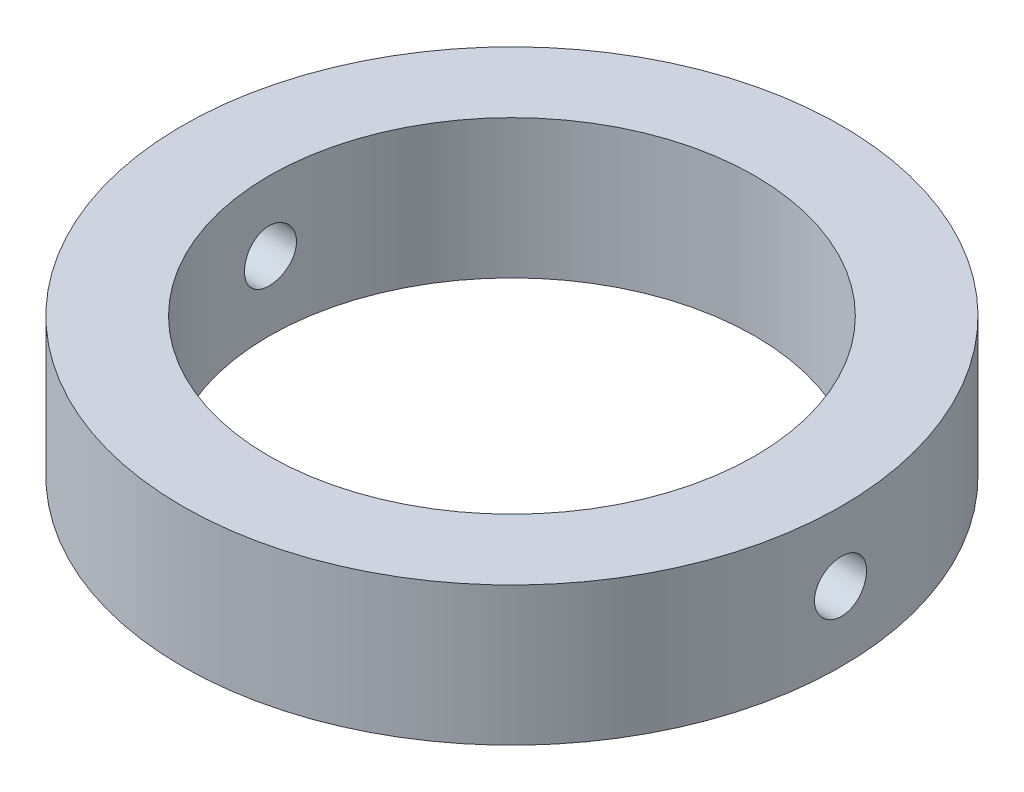
ISO-10303-21;
HEADER;
FILE_DESCRIPTION(('STEP AP214'),'2;1');
FILE_NAME('part.step','',(''),(''),'','','');
FILE_SCHEMA(('AUTOMOTIVE_DESIGN { 1 0 10303 214 1 1 1 1 }'));
ENDSEC;
DATA;
#1=APPLICATION_CONTEXT('core data for automotive mechanical design processes');
#2=APPLICATION_PROTOCOL_DEFINITION('international standard','automotive_design',2000,#1);
#3=PRODUCT_CONTEXT('',#1,'mechanical');
#4=PRODUCT('Part','Part','',(#3));
#5=PRODUCT_RELATED_PRODUCT_CATEGORY('part','',(#4));
#6=PRODUCT_DEFINITION_FORMATION('','',#4);
#7=PRODUCT_DEFINITION_CONTEXT('part definition',#1,'design');
#8=PRODUCT_DEFINITION('design','',#6,#7);
#9=PRODUCT_DEFINITION_SHAPE('','',#8);
#10=(LENGTH_UNIT() NAMED_UNIT(*) SI_UNIT(.MILLI.,.METRE.));
#11=(NAMED_UNIT(*) PLANE_ANGLE_UNIT() SI_UNIT($,.RADIAN.));
#12=(NAMED_UNIT(*) SI_UNIT($,.STERADIAN.) SOLID_ANGLE_UNIT());
#13=UNCERTAINTY_MEASURE_WITH_UNIT(LENGTH_MEASURE(1.E-05),#10,'distance_accuracy_value','');
#14=(GEOMETRIC_REPRESENTATION_CONTEXT(3) GLOBAL_UNCERTAINTY_ASSIGNED_CONTEXT((#13)) GLOBAL_UNIT_ASSIGNED_CONTEXT((#10,
#11,#12)) REPRESENTATION_CONTEXT('',''));
#15=CARTESIAN_POINT('',(0.,0.,0.));
#16=DIRECTION('',(0.,0.,1.));
#17=DIRECTION('',(1.,0.,0.));
#18=AXIS2_PLACEMENT_3D('',#15,#16,#17);
#19=CARTESIAN_POINT('',(0.,16.,0.));
#20=DIRECTION('',(0.,1.,0.));
#21=DIRECTION('',(0.,0.,1.));
#22=AXIS2_PLACEMENT_3D('',#19,#20,#21);
#23=PLANE('',#22);
#24=CARTESIAN_POINT('',(0.,16.,0.));
#25=DIRECTION('',(0.,1.,0.));
#26=DIRECTION('',(0.,0.,1.));
#27=AXIS2_PLACEMENT_3D('',#24,#25,#26);
#28=CIRCLE('',#27,38.);
#29=CARTESIAN_POINT('',(0.,16.,38.));
#30=VERTEX_POINT('',#29);
#31=EDGE_CURVE('E10',#30,#30,#28,.T.);
#32=ORIENTED_EDGE('',*,*,#31,.T.);
#33=EDGE_LOOP('',(#32));
#34=FACE_BOUND('',#33,.T.);
#35=CARTESIAN_POINT('',(0.,16.,0.));
#36=DIRECTION('',(0.,1.,0.));
#37=DIRECTION('',(0.,0.,1.));
#38=AXIS2_PLACEMENT_3D('',#35,#36,#37);
#39=CIRCLE('',#38,28.);
#40=CARTESIAN_POINT('',(0.,16.,28.));
#41=VERTEX_POINT('',#40);
#42=EDGE_CURVE('E46',#41,#41,#39,.T.);
#43=ORIENTED_EDGE('',*,*,#42,.F.);
#44=EDGE_LOOP('',(#43));
#45=FACE_BOUND('',#44,.T.);
#46=ADVANCED_FACE('F28',(#34,#45),#23,.T.);
#47=CARTESIAN_POINT('',(0.,0.,0.));
#48=DIRECTION('',(0.,1.,0.));
#49=DIRECTION('',(0.,0.,1.));
#50=AXIS2_PLACEMENT_3D('',#47,#48,#49);
#51=PLANE('',#50);
#52=CARTESIAN_POINT('',(0.,0.,0.));
#53=DIRECTION('',(0.,1.,0.));
#54=DIRECTION('',(0.,0.,1.));
#55=AXIS2_PLACEMENT_3D('',#52,#53,#54);
#56=CIRCLE('',#55,38.);
#57=CARTESIAN_POINT('',(0.,0.,38.));
#58=VERTEX_POINT('',#57);
#59=EDGE_CURVE('E41',#58,#58,#56,.T.);
#60=ORIENTED_EDGE('',*,*,#59,.F.);
#61=EDGE_LOOP('',(#60));
#62=FACE_BOUND('',#61,.T.);
#63=CARTESIAN_POINT('',(0.,0.,0.));
#64=DIRECTION('',(0.,1.,0.));
#65=DIRECTION('',(0.,0.,1.));
#66=AXIS2_PLACEMENT_3D('',#63,#64,#65);
#67=CIRCLE('',#66,28.);
#68=CARTESIAN_POINT('',(0.,0.,28.));
#69=VERTEX_POINT('',#68);
#70=EDGE_CURVE('E49',#69,#69,#67,.T.);
#71=ORIENTED_EDGE('',*,*,#70,.T.);
#72=EDGE_LOOP('',(#71));
#73=FACE_BOUND('',#72,.T.);
#74=ADVANCED_FACE('F82',(#62,#73),#51,.F.);
#75=CARTESIAN_POINT('',(0.,16.,0.));
#76=DIRECTION('',(0.,-1.,0.));
#77=DIRECTION('',(0.,0.,-1.));
#78=AXIS2_PLACEMENT_3D('',#75,#76,#77);
#79=CYLINDRICAL_SURFACE('',#78,38.);
#80=CARTESIAN_POINT('',(37.8813938496433,8.00000000000001,3.00000000136798));
#81=CARTESIAN_POINT('',(37.8813954247277,8.16822935622384,2.99999263922029));
#82=CARTESIAN_POINT('',(37.8825265581789,8.33657400624572,2.98580184986723));
#83=CARTESIAN_POINT('',(37.8869289646633,8.66860764995834,2.92939975069717));
#84=CARTESIAN_POINT('',(37.8902026780725,8.83229111250012,2.88715648860533));
#85=CARTESIAN_POINT('',(37.8985171540645,9.15014522375829,2.77587681745086));
#86=CARTESIAN_POINT('',(37.9035569308881,9.30432112294914,2.70685535281322));
#87=CARTESIAN_POINT('',(37.9148344390326,9.59886160169097,2.54400458582102));
#88=CARTESIAN_POINT('',(37.9210719099115,9.73922917388586,2.45018067516325));
#89=CARTESIAN_POINT('',(37.9340582511964,10.0025313722688,2.24015280482132));
#90=CARTESIAN_POINT('',(37.9408081454684,10.1254296076377,2.12390328291686));
#91=CARTESIAN_POINT('',(37.9540493837052,10.3499920901396,1.87242010853816));
#92=CARTESIAN_POINT('',(37.9605407164859,10.4516554195469,1.73718563599854));
#93=CARTESIAN_POINT('',(37.972542981191,10.630981686108,1.45135636856317));
#94=CARTESIAN_POINT('',(37.9780526329045,10.7086133794248,1.30074191327278));
#95=CARTESIAN_POINT('',(37.9874597537309,10.8374728234916,0.988565371131512));
#96=CARTESIAN_POINT('',(37.991357248489,10.8887009942588,0.827003458474964));
#97=CARTESIAN_POINT('',(37.9970937704784,10.9631951271541,0.497878391999106));
#98=CARTESIAN_POINT('',(37.998937107924,10.9865196467855,0.330328568389151));
#99=CARTESIAN_POINT('',(38.0003722094708,11.0047253592679,-0.00631733517473534));
#100=CARTESIAN_POINT('',(37.9999640115858,10.9996070323339,-0.175413388974751));
#101=CARTESIAN_POINT('',(37.9969456003317,10.961120322481,-0.509954785819958));
#102=CARTESIAN_POINT('',(37.9943402955711,10.9278149124016,-0.675407423904958));
#103=CARTESIAN_POINT('',(37.9872264183073,10.8339973270501,-0.998366667220426));
#104=CARTESIAN_POINT('',(37.9827178292766,10.7734849155182,-1.15587320343546));
#105=CARTESIAN_POINT('',(37.9722962502595,10.6269006037354,-1.45867001953501));
#106=CARTESIAN_POINT('',(37.9663817077746,10.5408004221702,-1.60394655280406));
#107=CARTESIAN_POINT('',(37.9538131184903,10.3455051786667,-1.87800944292068));
#108=CARTESIAN_POINT('',(37.9471590582539,10.2363096970583,-2.00679550004752));
#109=CARTESIAN_POINT('',(37.9338380623166,9.99756841972245,-2.24458971844848));
#110=CARTESIAN_POINT('',(37.9271711410131,9.86796791907055,-2.3535429652305));
#111=CARTESIAN_POINT('',(37.9145941322809,9.59228636571849,-2.54815472615563));
#112=CARTESIAN_POINT('',(37.9086840453874,9.44620530136597,-2.63381322382834));
#113=CARTESIAN_POINT('',(37.8982886352215,9.14167162060618,-2.77940144097541));
#114=CARTESIAN_POINT('',(37.8938034628082,8.98321769646531,-2.83932843642948));
#115=CARTESIAN_POINT('',(37.8867684946985,8.65845405262496,-2.93171253004239));
#116=CARTESIAN_POINT('',(37.8842186625344,8.49214448101243,-2.96417014580899));
#117=CARTESIAN_POINT('',(37.8813488494058,8.1568706295866,-3.00062486818604));
#118=CARTESIAN_POINT('',(37.8810228731009,7.98791471919118,-3.00469849642682));
#119=CARTESIAN_POINT('',(37.8826218487669,7.65172232551947,-2.98446993564192));
#120=CARTESIAN_POINT('',(37.8845467819249,7.4844858278842,-2.96016798377818));
#121=CARTESIAN_POINT('',(37.8904252097749,7.15669839674443,-2.88394184589966));
#122=CARTESIAN_POINT('',(37.8943760897144,6.99613913344636,-2.83205326092037));
#123=CARTESIAN_POINT('',(37.9038590549638,6.68600604322257,-2.70216294263448));
#124=CARTESIAN_POINT('',(37.9093911630826,6.5364323748008,-2.62416083264316));
#125=CARTESIAN_POINT('',(37.9214277777632,6.25216583862471,-2.44406357696854));
#126=CARTESIAN_POINT('',(37.9279343341925,6.11750540703548,-2.34191737290753));
#127=CARTESIAN_POINT('',(37.9411797160711,5.86721543365059,-2.11650535809967));
#128=CARTESIAN_POINT('',(37.9479185451102,5.75158618615822,-1.99323922080871));
#129=CARTESIAN_POINT('',(37.9608869464676,5.54238031019895,-1.72875604772394));
#130=CARTESIAN_POINT('',(37.967115351569,5.44885335302464,-1.58749965692047));
#131=CARTESIAN_POINT('',(37.9783443227521,5.28684753712071,-1.29124223255021));
#132=CARTESIAN_POINT('',(37.9833449000181,5.21836845023049,-1.13624132419797));
#133=CARTESIAN_POINT('',(37.9915493741001,5.10848780849599,-0.817073836846167));
#134=CARTESIAN_POINT('',(37.9947553195688,5.06705536967279,-0.652917945133982));
#135=CARTESIAN_POINT('',(37.9990175942436,5.01234316856039,-0.31995323113549));
#136=CARTESIAN_POINT('',(38.0000739595546,4.99906293342051,-0.15114448704777));
#137=CARTESIAN_POINT('',(37.9999181203287,5.00103738825244,0.185844009098617));
#138=CARTESIAN_POINT('',(37.9987120758709,5.01621459437893,0.354024223435183));
#139=CARTESIAN_POINT('',(37.9941791393543,5.07451174014156,0.6854394614441));
#140=CARTESIAN_POINT('',(37.9908522441835,5.11763172078056,0.848674477859564));
#141=CARTESIAN_POINT('',(37.9824510314721,5.2305711643484,1.16557212655111));
#142=CARTESIAN_POINT('',(37.9773767903776,5.300389459246,1.31923517725156));
#143=CARTESIAN_POINT('',(37.9660490429073,5.46473448694461,1.61267080987403));
#144=CARTESIAN_POINT('',(37.9597955579553,5.55926077087811,1.75244364407452));
#145=CARTESIAN_POINT('',(37.9467913111636,5.77062894635915,2.01452730921582));
#146=CARTESIAN_POINT('',(37.9400393034311,5.88752799629679,2.13679198007571));
#147=CARTESIAN_POINT('',(37.9268095476607,6.14022395022346,2.36001193224921));
#148=CARTESIAN_POINT('',(37.9203318665969,6.2760254347582,2.46096203352618));
#149=CARTESIAN_POINT('',(37.908372029993,6.56290913188316,2.63880908663818));
#150=CARTESIAN_POINT('',(37.9028916085506,6.71401726384954,2.71566430535131));
#151=CARTESIAN_POINT('',(37.893568149171,7.02693165263143,2.84281465399115));
#152=CARTESIAN_POINT('',(37.889723221462,7.18872531137915,2.89314045417663));
#153=CARTESIAN_POINT('',(37.8850993600132,7.45956833681261,2.95292421214279));
#154=CARTESIAN_POINT('',(37.8837161393548,7.56687359108413,2.9705543171514));
#155=CARTESIAN_POINT('',(37.8818628766713,7.78276987188638,2.99409457506204));
#156=CARTESIAN_POINT('',(37.8813928324858,7.89136089537435,3.00000475569356));
#157=CARTESIAN_POINT('',(37.8813938496433,8.00000000000001,3.00000000136798));
#158=B_SPLINE_CURVE_WITH_KNOTS('',3,(#80,#81,#82,#83,#84,#85,#86,#87,#88,#89,#90,#91,#92,#93,
#94,#95,#96,#97,#98,#99,#100,#101,#102,#103,#104,#105,#106,#107,#108,#109,#110,#111,#112,#113,
#114,#115,#116,#117,#118,#119,#120,#121,#122,#123,#124,#125,#126,#127,#128,#129,#130,#131,#132,
#133,#134,#135,#136,#137,#138,#139,#140,#141,#142,#143,#144,#145,#146,#147,#148,#149,#150,#151,
#152,#153,#154,#155,#156,#157),.UNSPECIFIED.,.T.,.F.,(4,2,2,2,2,2,2,2,2,2,2,2,2,2,2,2,2,2,2,2,2,
2,2,2,2,2,2,2,2,2,2,2,2,2,2,2,2,2,4),(0.,0.504291421670324,1.00915822788368,1.51374368152958,
2.01821953559274,2.52373134073378,3.02926498845791,3.53545315301472,4.04163326507086,
4.54674925358318,5.05185671399028,5.55583868228743,6.05982502713879,6.56437049631074,
7.06892513448854,7.57485624621323,8.08078771565205,8.58677273144004,9.09274821269882,
9.59735908295675,10.1019657357276,10.6059227598399,11.1098870537899,11.6149267875573,
12.1199743306597,12.6261463157286,13.1323136899712,13.6379020669618,14.1434819519103,
14.6476872439442,15.1518932758439,15.6560772516308,16.1602520685957,16.6657325841813,
17.1713358046313,17.6778099691556,18.1836973153042,18.5093592531181,18.8350204204103),.UNSPECIFIED.);
#159=CARTESIAN_POINT('',(37.8813938496433,8.00000000000001,3.00000000136798));
#160=VERTEX_POINT('',#159);
#161=EDGE_CURVE('E72',#160,#160,#158,.T.);
#162=ORIENTED_EDGE('',*,*,#161,.T.);
#163=EDGE_LOOP('',(#162));
#164=FACE_BOUND('',#163,.T.);
#165=CARTESIAN_POINT('',(-37.8813938499381,8.00000000000001,2.99999999764511));
#166=CARTESIAN_POINT('',(-37.8813954250225,7.83177064377618,2.99999263549743));
#167=CARTESIAN_POINT('',(-37.8825265584723,7.66342599375429,2.98580184614425));
#168=CARTESIAN_POINT('',(-37.8869289649512,7.33139235004167,2.92939974697376));
#169=CARTESIAN_POINT('',(-37.8902026783562,7.16770888749989,2.88715648488159));
#170=CARTESIAN_POINT('',(-37.8985171543373,6.84985477624172,2.77587681372631));
#171=CARTESIAN_POINT('',(-37.9035569311541,6.69567887705087,2.70685534908818));
#172=CARTESIAN_POINT('',(-37.9148344392827,6.40113839830904,2.54400458209487));
#173=CARTESIAN_POINT('',(-37.9210719101523,6.26077082611415,2.45018067143648));
#174=CARTESIAN_POINT('',(-37.9340582514166,5.99746862773118,2.24015280109328));
#175=CARTESIAN_POINT('',(-37.9408081456771,5.87457039236227,2.12390327918815));
#176=CARTESIAN_POINT('',(-37.9540493838893,5.6500079098604,1.87242010480815));
#177=CARTESIAN_POINT('',(-37.9605407166566,5.54834458045307,1.73718563226789));
#178=CARTESIAN_POINT('',(-37.9725429813336,5.369018313892,1.45135636483134));
#179=CARTESIAN_POINT('',(-37.9780526330324,5.29138662057517,1.30074190954041));
#180=CARTESIAN_POINT('',(-37.987459753828,5.16252717650844,0.988565367398219));
#181=CARTESIAN_POINT('',(-37.9913572485703,5.11129900574117,0.827003454741289));
#182=CARTESIAN_POINT('',(-37.9970937705273,5.03680487284595,0.497878388264866));
#183=CARTESIAN_POINT('',(-37.9989371079565,5.01348035321449,0.330328564654731));
#184=CARTESIAN_POINT('',(-38.0003722094702,4.99527464073211,-0.00631733890929647));
#185=CARTESIAN_POINT('',(-37.9999640115686,5.00039296766609,-0.175413392709272));
#186=CARTESIAN_POINT('',(-37.9969456002816,5.03887967751906,-0.509954789554182));
#187=CARTESIAN_POINT('',(-37.9943402955047,5.0721850875984,-0.675407427638927));
#188=CARTESIAN_POINT('',(-37.9872264182092,5.16600267294993,-0.998366670953695));
#189=CARTESIAN_POINT('',(-37.982717829163,5.22651508448179,-1.15587320716829));
#190=CARTESIAN_POINT('',(-37.9722962501161,5.37309939626457,-1.45867002326681));
#191=CARTESIAN_POINT('',(-37.966381707617,5.45919957782985,-1.60394655653528));
#192=CARTESIAN_POINT('',(-37.9538131183057,5.65449482133328,-1.87800944665066));
#193=CARTESIAN_POINT('',(-37.9471590580566,5.76369030294174,-2.00679550377685));
#194=CARTESIAN_POINT('',(-37.933838062096,6.00243158027756,-2.2445897221765));
#195=CARTESIAN_POINT('',(-37.9271711407818,6.13203208092947,-2.35354296895787));
#196=CARTESIAN_POINT('',(-37.9145941320305,6.40771363428152,-2.54815472988176));
#197=CARTESIAN_POINT('',(-37.9086840451286,6.55379469863404,-2.63381322755389));
#198=CARTESIAN_POINT('',(-37.8982886349483,6.85832837939383,-2.77940144469994));
#199=CARTESIAN_POINT('',(-37.8938034625291,7.0167823035347,-2.83932844015357));
#200=CARTESIAN_POINT('',(-37.8867684944104,7.34154594737505,-2.93171253376579));
#201=CARTESIAN_POINT('',(-37.8842186622431,7.50785551898758,-2.96417014953214));
#202=CARTESIAN_POINT('',(-37.8813488491109,7.84312937041341,-3.00062487190891));
#203=CARTESIAN_POINT('',(-37.8810228728056,8.01208528080883,-3.00469850014966));
#204=CARTESIAN_POINT('',(-37.8826218484736,8.34827767448054,-2.98446993936491));
#205=CARTESIAN_POINT('',(-37.884546781634,8.51551417211581,-2.96016798750136));
#206=CARTESIAN_POINT('',(-37.8904252094915,8.84330160325558,-2.88394184962342));
#207=CARTESIAN_POINT('',(-37.8943760894361,9.00386086655365,-2.83205326464452));
#208=CARTESIAN_POINT('',(-37.9038590546982,9.31399395677744,-2.70216294635956));
#209=CARTESIAN_POINT('',(-37.9093911628247,9.46356762519922,-2.62416083636878));
#210=CARTESIAN_POINT('',(-37.921427777523,9.7478341613753,-2.44406358069535));
#211=CARTESIAN_POINT('',(-37.9279343339624,9.88249459296453,-2.34191737663497));
#212=CARTESIAN_POINT('',(-37.9411797158631,10.1327845663494,-2.11650536182842));
#213=CARTESIAN_POINT('',(-37.9479185449143,10.2484138138418,-1.99323922453812));
#214=CARTESIAN_POINT('',(-37.9608869462977,10.4576196898011,-1.72875605145462));
#215=CARTESIAN_POINT('',(-37.9671153514129,10.5511466469754,-1.58749966065176));
#216=CARTESIAN_POINT('',(-37.9783443226252,10.7131524628793,-1.29124223628261));
#217=CARTESIAN_POINT('',(-37.9833448999064,10.7816315497695,-1.13624132793086));
#218=CARTESIAN_POINT('',(-37.9915493740198,10.891512191504,-0.817073840579863));
#219=CARTESIAN_POINT('',(-37.9947553195046,10.9329446303272,-0.652917948867993));
#220=CARTESIAN_POINT('',(-37.9990175942122,10.9876568314396,-0.31995323486992));
#221=CARTESIAN_POINT('',(-38.0000739595397,11.0009370665795,-0.151144490782303));
#222=CARTESIAN_POINT('',(-37.9999181203469,10.9989626117476,0.185844005364099));
#223=CARTESIAN_POINT('',(-37.9987120759057,10.9837854056211,0.354024219700783));
#224=CARTESIAN_POINT('',(-37.9941791394217,10.9254882598585,0.685439457710145));
#225=CARTESIAN_POINT('',(-37.9908522442669,10.8823682792195,0.848674474125937));
#226=CARTESIAN_POINT('',(-37.9824510315866,10.7694288356516,1.16557212281831));
#227=CARTESIAN_POINT('',(-37.9773767905072,10.699610540754,1.31923517351926));
#228=CARTESIAN_POINT('',(-37.9660490430658,10.5352655130554,1.61267080614284));
#229=CARTESIAN_POINT('',(-37.9597955581275,10.4407392291219,1.75244364034394));
#230=CARTESIAN_POINT('',(-37.9467913113616,10.2293710536409,2.01452730548652));
#231=CARTESIAN_POINT('',(-37.9400393036412,10.1124720037032,2.13679197634707));
#232=CARTESIAN_POINT('',(-37.9268095478927,9.85977604977656,2.36001192852188));
#233=CARTESIAN_POINT('',(-37.9203318668388,9.72397456524182,2.46096202979949));
#234=CARTESIAN_POINT('',(-37.9083720302523,9.43709086811686,2.63880908291266));
#235=CARTESIAN_POINT('',(-37.9028916088175,9.28598273615048,2.71566430162632));
#236=CARTESIAN_POINT('',(-37.8935681494504,8.97306834736859,2.84281465026708));
#237=CARTESIAN_POINT('',(-37.8897232217464,8.81127468862087,2.89314045045294));
#238=CARTESIAN_POINT('',(-37.8850993603034,8.54043166318741,2.95292420841956));
#239=CARTESIAN_POINT('',(-37.8837161396467,8.43312640891588,2.97055431342831));
#240=CARTESIAN_POINT('',(-37.8818628769656,8.21723012811363,2.99409457133912));
#241=CARTESIAN_POINT('',(-37.8813928327806,8.10863910462567,3.00000475197069));
#242=CARTESIAN_POINT('',(-37.8813938499381,8.00000000000001,2.99999999764511));
#243=B_SPLINE_CURVE_WITH_KNOTS('',3,(#165,#166,#167,#168,#169,#170,#171,#172,#173,#174,#175,
#176,#177,#178,#179,#180,#181,#182,#183,#184,#185,#186,#187,#188,#189,#190,#191,#192,#193,#194,
#195,#196,#197,#198,#199,#200,#201,#202,#203,#204,#205,#206,#207,#208,#209,#210,#211,#212,#213,
#214,#215,#216,#217,#218,#219,#220,#221,#222,#223,#224,#225,#226,#227,#228,#229,#230,#231,#232,
#233,#234,#235,#236,#237,#238,#239,#240,#241,#242),.UNSPECIFIED.,.T.,.F.,(4,2,2,2,2,2,2,2,2,2,2,
2,2,2,2,2,2,2,2,2,2,2,2,2,2,2,2,2,2,2,2,2,2,2,2,2,2,2,4),(0.,0.504291421670322,1.00915822788368,
1.51374368152958,2.01821953559274,2.52373134073378,3.02926498845791,3.53545315301472,
4.04163326507086,4.54674925358318,5.05185671399028,5.55583868228743,6.05982502713879,
6.56437049631074,7.06892513448853,7.57485624621323,8.08078771565205,8.58677273144004,
9.09274821269882,9.59735908295675,10.1019657357276,10.6059227598399,11.1098870537899,
11.6149267875573,12.1199743306597,12.6261463157286,13.1323136899712,13.6379020669618,
14.1434819519103,14.6476872439442,15.1518932758439,15.6560772516308,16.1602520685957,
16.6657325841813,17.1713358046313,17.6778099691556,18.1836973153042,18.5093592531181,
18.8350204204103),.UNSPECIFIED.);
#244=CARTESIAN_POINT('',(-37.8813938499381,8.00000000000001,2.99999999764511));
#245=VERTEX_POINT('',#244);
#246=EDGE_CURVE('E68',#245,#245,#243,.T.);
#247=ORIENTED_EDGE('',*,*,#246,.T.);
#248=EDGE_LOOP('',(#247));
#249=FACE_BOUND('',#248,.T.);
#250=ORIENTED_EDGE('',*,*,#31,.F.);
#251=EDGE_LOOP('',(#250));
#252=FACE_BOUND('',#251,.T.);
#253=ORIENTED_EDGE('',*,*,#59,.T.);
#254=EDGE_LOOP('',(#253));
#255=FACE_BOUND('',#254,.T.);
#256=ADVANCED_FACE('F30',(#164,#249,#252,#255),#79,.T.);
#257=CARTESIAN_POINT('',(0.,16.,0.));
#258=DIRECTION('',(0.,-1.,0.));
#259=DIRECTION('',(0.,0.,-1.));
#260=AXIS2_PLACEMENT_3D('',#257,#258,#259);
#261=CYLINDRICAL_SURFACE('',#260,28.);
#262=CARTESIAN_POINT('',(27.8388218140559,8.00000000000001,3.0000000008745));
#263=CARTESIAN_POINT('',(27.8388239140942,8.16799161655128,2.99999275669101));
#264=CARTESIAN_POINT('',(27.8403588112543,8.33609271247133,2.98584186179032));
#265=CARTESIAN_POINT('',(27.8463313249008,8.66762961250487,2.92960753886816));
#266=CARTESIAN_POINT('',(27.8507720966225,8.83106014371226,2.88749374765022));
#267=CARTESIAN_POINT('',(27.8620477051948,9.14840702983666,2.77657808743123));
#268=CARTESIAN_POINT('',(27.8688810447878,9.30232926429486,2.70779290637314));
#269=CARTESIAN_POINT('',(27.884170014224,9.59641225405978,2.54552010800223));
#270=CARTESIAN_POINT('',(27.8926253336377,9.7365756349161,2.45203721627695));
#271=CARTESIAN_POINT('',(27.9102448825408,9.99977617408859,2.24260606603409));
#272=CARTESIAN_POINT('',(27.9194116175376,10.1227480945021,2.12657602293142));
#273=CARTESIAN_POINT('',(27.9373984581689,10.347512728714,1.87551945151974));
#274=CARTESIAN_POINT('',(27.9462185475721,10.4493044517276,1.74049203503093));
#275=CARTESIAN_POINT('',(27.9625433472446,10.6290473293931,1.45487075437045));
#276=CARTESIAN_POINT('',(27.9700448309829,10.7069403431771,1.30424010176395));
#277=CARTESIAN_POINT('',(27.9828598555148,10.8363026478188,0.991943068407499));
#278=CARTESIAN_POINT('',(27.9881734569474,10.8877726710204,0.830276993657862));
#279=CARTESIAN_POINT('',(27.9959964120614,10.9626355063842,0.501160045281621));
#280=CARTESIAN_POINT('',(27.9985165078136,10.9861358980937,0.333733901708678));
#281=CARTESIAN_POINT('',(28.000505081916,11.0047253928856,-0.00270370141545228));
#282=CARTESIAN_POINT('',(27.9999736501857,10.99981533314,-0.171715114106922));
#283=CARTESIAN_POINT('',(27.9959278118773,10.9618103367401,-0.505794911067912));
#284=CARTESIAN_POINT('',(27.9924256490713,10.9288310844758,-0.670876624645019));
#285=CARTESIAN_POINT('',(27.9828458599961,10.8358042469321,-0.993148462320761));
#286=CARTESIAN_POINT('',(27.9767681960733,10.7757562659096,-1.15033847100581));
#287=CARTESIAN_POINT('',(27.9626995009827,10.6301706795959,-1.45272779147152));
#288=CARTESIAN_POINT('',(27.9547046557939,10.5445821802386,-1.5979024156188));
#289=CARTESIAN_POINT('',(27.9376980036054,10.3503820703457,-1.87187062788527));
#290=CARTESIAN_POINT('',(27.9286861623458,10.2417696840883,-2.00066366384126));
#291=CARTESIAN_POINT('',(27.9106026765438,10.0039549928453,-2.23889087080591));
#292=CARTESIAN_POINT('',(27.9015309589871,9.87465200243677,-2.34822454995597));
#293=CARTESIAN_POINT('',(27.8843951954855,9.59947477555962,-2.54365066444249));
#294=CARTESIAN_POINT('',(27.8763311513808,9.45360050883027,-2.62974305733718));
#295=CARTESIAN_POINT('',(27.8621233038467,9.14934110115391,-2.77624389763266));
#296=CARTESIAN_POINT('',(27.8559800008106,8.99095271345637,-2.83664565355776));
#297=CARTESIAN_POINT('',(27.846319414006,8.66620148318774,-2.92996859992934));
#298=CARTESIAN_POINT('',(27.8428020381036,8.49983892061823,-2.96289075453585));
#299=CARTESIAN_POINT('',(27.8388077765429,8.16474537250467,-3.0001896904023));
#300=CARTESIAN_POINT('',(27.8383158931627,7.9960302317014,-3.00470727891782));
#301=CARTESIAN_POINT('',(27.8403887120046,7.66024541059615,-2.9854390919975));
#302=CARTESIAN_POINT('',(27.8429533666911,7.49317570474491,-2.9616537567321));
#303=CARTESIAN_POINT('',(27.8508366370225,7.16583770848691,-2.88657290719467));
#304=CARTESIAN_POINT('',(27.8561485443754,7.00555387495632,-2.83534439332058));
#305=CARTESIAN_POINT('',(27.868922365886,6.69585353399425,-2.70689992473858));
#306=CARTESIAN_POINT('',(27.8763843363153,6.54643731111901,-2.62968328985845));
#307=CARTESIAN_POINT('',(27.8926537210061,6.26207301104219,-2.45110346482686));
#308=CARTESIAN_POINT('',(27.9014662720223,6.12718366891412,-2.34964722232929));
#309=CARTESIAN_POINT('',(27.9194272447841,5.87629872428,-2.1256010392601));
#310=CARTESIAN_POINT('',(27.9285756760794,5.76030365949223,-2.00301049742501));
#311=CARTESIAN_POINT('',(27.9462231059356,5.55001198321218,-1.73956362876027));
#312=CARTESIAN_POINT('',(27.9547192521952,5.4558074054222,-1.59863361983182));
#313=CARTESIAN_POINT('',(27.9700630218575,5.29240505320976,-1.30287075034472));
#314=CARTESIAN_POINT('',(27.9769106707251,5.22320689249844,-1.14803810459441));
#315=CARTESIAN_POINT('',(27.98817308496,5.11193656006577,-0.8291822704815));
#316=CARTESIAN_POINT('',(27.9925927762608,5.06980943587178,-0.665178439844206));
#317=CARTESIAN_POINT('',(27.9985215771837,5.01369780787845,-0.332375298988041));
#318=CARTESIAN_POINT('',(28.0000307815768,4.9997123877321,-0.163576145095462));
#319=CARTESIAN_POINT('',(27.9999684106557,5.00029514984487,0.173123510631119));
#320=CARTESIAN_POINT('',(27.998412222707,5.01472071726745,0.34102428028078));
#321=CARTESIAN_POINT('',(27.9924243266567,5.07141612064211,0.672002127887851));
#322=CARTESIAN_POINT('',(27.9879926172674,5.11368596906204,0.835079203685317));
#323=CARTESIAN_POINT('',(27.9767499594585,5.2248290937546,1.15177466952259));
#324=CARTESIAN_POINT('',(27.9699394487059,5.29369747650637,1.30539479340104));
#325=CARTESIAN_POINT('',(27.9546970274437,5.45606776807888,1.59891838242321));
#326=CARTESIAN_POINT('',(27.9462651187315,5.54956964959199,1.73882186277238));
#327=CARTESIAN_POINT('',(27.9286730126609,5.75908606962872,2.00167135502141));
#328=CARTESIAN_POINT('',(27.9195095032496,5.87520686656009,2.12453244966786));
#329=CARTESIAN_POINT('',(27.9015146688484,6.12645102476827,2.34908581718675));
#330=CARTESIAN_POINT('',(27.8926834237898,6.26157892190942,2.45077302270199));
#331=CARTESIAN_POINT('',(27.8763258600434,6.54743430400494,2.63032958604584));
#332=CARTESIAN_POINT('',(27.8688033720131,6.69820558643684,2.70812951908438));
#333=CARTESIAN_POINT('',(27.8559604015502,7.01065979593719,2.83720205686249));
#334=CARTESIAN_POINT('',(27.8506374600082,7.17233030099903,2.88850430234696));
#335=CARTESIAN_POINT('',(27.8441256038909,7.44574702161235,2.95046545481551));
#336=CARTESIAN_POINT('',(27.84214621804,7.55575090630757,2.96901517979812));
#337=CARTESIAN_POINT('',(27.8394936298019,7.77715380427546,2.99378482487247));
#338=CARTESIAN_POINT('',(27.838820420871,7.88855281055615,3.00000480673271));
#339=CARTESIAN_POINT('',(27.8388218140559,8.00000000000001,3.0000000008745));
#340=B_SPLINE_CURVE_WITH_KNOTS('',3,(#262,#263,#264,#265,#266,#267,#268,#269,#270,#271,#272,
#273,#274,#275,#276,#277,#278,#279,#280,#281,#282,#283,#284,#285,#286,#287,#288,#289,#290,#291,
#292,#293,#294,#295,#296,#297,#298,#299,#300,#301,#302,#303,#304,#305,#306,#307,#308,#309,#310,
#311,#312,#313,#314,#315,#316,#317,#318,#319,#320,#321,#322,#323,#324,#325,#326,#327,#328,#329,
#330,#331,#332,#333,#334,#335,#336,#337,#338,#339),.UNSPECIFIED.,.T.,.F.,(4,2,2,2,2,2,2,2,2,2,2,
2,2,2,2,2,2,2,2,2,2,2,2,2,2,2,2,2,2,2,2,2,2,2,2,2,2,2,4),(0.,0.503567826672532,1.00768334295683,
1.5114839483477,2.01518822773256,2.52075488297965,3.02634518272725,3.53315590587565,
4.03995258141579,4.54479360044455,5.04961974337516,5.55237531471365,6.05513823654641,
6.55890977079471,7.06269828083471,7.56901738797261,8.0753374197125,8.58178924874885,
9.08822330747157,9.59214487642918,10.0960586084409,10.5987476437928,11.1014498367605,
11.6061137478583,12.1107920188389,12.6175644239478,13.1243290003101,13.630061600001,
14.1357777318171,14.6389617863096,15.1421460661134,15.6452378156032,16.1483290073895,
16.6538432288363,17.159478291778,17.6665692926786,18.1730918180808,18.5071650372245,
18.8412365827523),.UNSPECIFIED.);
#341=CARTESIAN_POINT('',(27.8388218140559,8.00000000000001,3.0000000008745));
#342=VERTEX_POINT('',#341);
#343=EDGE_CURVE('E33',#342,#342,#340,.T.);
#344=ORIENTED_EDGE('',*,*,#343,.F.);
#345=EDGE_LOOP('',(#344));
#346=FACE_BOUND('',#345,.T.);
#347=CARTESIAN_POINT('',(-27.8388218143507,8.00000000000001,2.99999999813858));
#348=CARTESIAN_POINT('',(-27.8388239143891,7.83200838344873,2.9999927539551));
#349=CARTESIAN_POINT('',(-27.8403588115477,7.66390728752868,2.98584185905426));
#350=CARTESIAN_POINT('',(-27.8463313251887,7.33237038749515,2.9296075361315));
#351=CARTESIAN_POINT('',(-27.8507720969063,7.16893985628776,2.88749374491313));
#352=CARTESIAN_POINT('',(-27.8620477054677,6.85159297016335,2.77657808469303));
#353=CARTESIAN_POINT('',(-27.8688810450539,6.69767073570516,2.70779290363427));
#354=CARTESIAN_POINT('',(-27.8841700144742,6.40358774594023,2.54552010526186));
#355=CARTESIAN_POINT('',(-27.8926253338786,6.26342436508391,2.45203721353575));
#356=CARTESIAN_POINT('',(-27.9102448827612,6.00022382591142,2.24260606329116));
#357=CARTESIAN_POINT('',(-27.9194116177466,5.87725190549793,2.12657602018758));
#358=CARTESIAN_POINT('',(-27.9373984583532,5.65248727128601,1.87551944877414));
#359=CARTESIAN_POINT('',(-27.9462185477431,5.55069554827237,1.74049203228446));
#360=CARTESIAN_POINT('',(-27.9625433473876,5.37095267060694,1.45487075162238));
#361=CARTESIAN_POINT('',(-27.970044831111,5.29305965682288,1.30424009901514));
#362=CARTESIAN_POINT('',(-27.9828598556123,5.16369735218122,0.991943065657428));
#363=CARTESIAN_POINT('',(-27.988173457029,5.11222732897965,0.830276990907268));
#364=CARTESIAN_POINT('',(-27.9959964121107,5.03736449361577,0.501160042530258));
#365=CARTESIAN_POINT('',(-27.9985165078464,5.01386410190631,0.333733898957068));
#366=CARTESIAN_POINT('',(-28.0005050819157,4.99527460711446,-0.00270370416725828));
#367=CARTESIAN_POINT('',(-27.9999736501688,5.00018466685998,-0.171715116858676));
#368=CARTESIAN_POINT('',(-27.9959278118276,5.03818966325988,-0.505794913819268));
#369=CARTESIAN_POINT('',(-27.9924256490054,5.07116891552419,-0.670876627396031));
#370=CARTESIAN_POINT('',(-27.9828458598985,5.16419575306789,-0.993148465070832));
#371=CARTESIAN_POINT('',(-27.9767681959603,5.22424373409044,-1.15033847375528));
#372=CARTESIAN_POINT('',(-27.9626995008399,5.36982932040413,-1.45272779421961));
#373=CARTESIAN_POINT('',(-27.9547046556369,5.45541781976141,-1.5979024183661));
#374=CARTESIAN_POINT('',(-27.9376980034214,5.64961792965429,-1.8718706306309));
#375=CARTESIAN_POINT('',(-27.9286861621492,5.75823031591171,-2.00066366658601));
#376=CARTESIAN_POINT('',(-27.9106026763237,5.99604500715471,-2.23889087354888));
#377=CARTESIAN_POINT('',(-27.9015309587563,6.12534799756324,-2.34822455269804));
#378=CARTESIAN_POINT('',(-27.8843951952355,6.40052522444039,-2.54365066718289));
#379=CARTESIAN_POINT('',(-27.8763311511223,6.54639949116975,-2.62974306007679));
#380=CARTESIAN_POINT('',(-27.8621233035738,6.85065889884611,-2.77624390037087));
#381=CARTESIAN_POINT('',(-27.8559800005319,7.00904728654364,-2.83664565629536));
#382=CARTESIAN_POINT('',(-27.8463194137181,7.33379851681228,-2.929968602666));
#383=CARTESIAN_POINT('',(-27.8428020378124,7.50016107938179,-2.96289075727216));
#384=CARTESIAN_POINT('',(-27.8388077762481,7.83525462749534,-3.00018969313822));
#385=CARTESIAN_POINT('',(-27.8383158928674,8.00396976829861,-3.00470728165369));
#386=CARTESIAN_POINT('',(-27.8403887117112,8.33975458940387,-2.98543909473357));
#387=CARTESIAN_POINT('',(-27.8429533664001,8.50682429525511,-2.96165375946842));
#388=CARTESIAN_POINT('',(-27.8508366367388,8.83416229151311,-2.88657290993177));
#389=CARTESIAN_POINT('',(-27.8561485440968,8.9944461250437,-2.8353443960582));
#390=CARTESIAN_POINT('',(-27.86892236562,9.30414646600577,-2.70689992747745));
#391=CARTESIAN_POINT('',(-27.8763843360569,9.45356268888101,-2.62968329259806));
#392=CARTESIAN_POINT('',(-27.8926537207652,9.73792698895783,-2.45110346756807));
#393=CARTESIAN_POINT('',(-27.9014662717914,9.8728163310859,-2.34964722507136));
#394=CARTESIAN_POINT('',(-27.9194272445752,10.12370127572,-2.12560104200393));
#395=CARTESIAN_POINT('',(-27.9285756758825,10.2396963405078,-2.00301050016975));
#396=CARTESIAN_POINT('',(-27.9462231057646,10.4499880167878,-1.73956363150674));
#397=CARTESIAN_POINT('',(-27.954719252038,10.5441925945778,-1.59863362257912));
#398=CARTESIAN_POINT('',(-27.9700630217295,10.7075949467903,-1.30287075309352));
#399=CARTESIAN_POINT('',(-27.9769106706123,10.7767931075016,-1.14803810734389));
#400=CARTESIAN_POINT('',(-27.9881730848785,10.8880634399342,-0.829182273232089));
#401=CARTESIAN_POINT('',(-27.9925927761954,10.9301905641282,-0.665178442595229));
#402=CARTESIAN_POINT('',(-27.998521577151,10.9863021921216,-0.332375301739647));
#403=CARTESIAN_POINT('',(-28.0000307815607,11.0002876122679,-0.163576147847216));
#404=CARTESIAN_POINT('',(-27.9999684106728,10.9997048501551,0.173123507879371));
#405=CARTESIAN_POINT('',(-27.9984122227405,10.9852792827326,0.341024277529186));
#406=CARTESIAN_POINT('',(-27.9924243267227,10.9285838793579,0.672002125136845));
#407=CARTESIAN_POINT('',(-27.9879926173495,10.886314030938,0.835079200934746));
#408=CARTESIAN_POINT('',(-27.9767499595717,10.7751709062454,1.15177466677312));
#409=CARTESIAN_POINT('',(-27.9699394488342,10.7063025234936,1.30539479065224));
#410=CARTESIAN_POINT('',(-27.9546970276008,10.5439322319211,1.59891837967591));
#411=CARTESIAN_POINT('',(-27.9462651189024,10.450430350408,1.73882186002591));
#412=CARTESIAN_POINT('',(-27.9286730128576,10.2409139303713,2.00167135227667));
#413=CARTESIAN_POINT('',(-27.9195095034584,10.1247931334399,2.12453244692402));
#414=CARTESIAN_POINT('',(-27.9015146690793,9.87354897523174,2.34908581444468));
#415=CARTESIAN_POINT('',(-27.8926834240307,9.73842107809059,2.45077301996079));
#416=CARTESIAN_POINT('',(-27.8763258603019,9.45256569599507,2.63032958330624));
#417=CARTESIAN_POINT('',(-27.8688033722793,9.30179441356318,2.70812951634552));
#418=CARTESIAN_POINT('',(-27.855960401829,8.98934020406283,2.83720205412489));
#419=CARTESIAN_POINT('',(-27.850637460292,8.82766969900098,2.88850429960988));
#420=CARTESIAN_POINT('',(-27.8441256041809,8.55425297838766,2.95046545207908));
#421=CARTESIAN_POINT('',(-27.8421462183318,8.44424909369244,2.96901517706188));
#422=CARTESIAN_POINT('',(-27.8394936300961,8.22284619572455,2.99378482213649));
#423=CARTESIAN_POINT('',(-27.8388204211658,8.11144718944386,3.00000480399679));
#424=CARTESIAN_POINT('',(-27.8388218143507,8.00000000000001,2.99999999813858));
#425=B_SPLINE_CURVE_WITH_KNOTS('',3,(#347,#348,#349,#350,#351,#352,#353,#354,#355,#356,#357,
#358,#359,#360,#361,#362,#363,#364,#365,#366,#367,#368,#369,#370,#371,#372,#373,#374,#375,#376,
#377,#378,#379,#380,#381,#382,#383,#384,#385,#386,#387,#388,#389,#390,#391,#392,#393,#394,#395,
#396,#397,#398,#399,#400,#401,#402,#403,#404,#405,#406,#407,#408,#409,#410,#411,#412,#413,#414,
#415,#416,#417,#418,#419,#420,#421,#422,#423,#424),.UNSPECIFIED.,.T.,.F.,(4,2,2,2,2,2,2,2,2,2,2,
2,2,2,2,2,2,2,2,2,2,2,2,2,2,2,2,2,2,2,2,2,2,2,2,2,2,2,4),(0.,0.503567826672533,1.00768334295683,
1.5114839483477,2.01518822773256,2.52075488297965,3.02634518272725,3.53315590587565,
4.03995258141579,4.54479360044455,5.04961974337517,5.55237531471365,6.05513823654641,
6.55890977079471,7.06269828083471,7.56901738797261,8.0753374197125,8.58178924874884,
9.08822330747157,9.59214487642918,10.0960586084409,10.5987476437928,11.1014498367605,
11.6061137478583,12.1107920188389,12.6175644239478,13.1243290003101,13.630061600001,
14.1357777318171,14.6389617863096,15.1421460661134,15.6452378156032,16.1483290073895,
16.6538432288363,17.159478291778,17.6665692926786,18.1730918180808,18.5071650372245,
18.8412365827523),.UNSPECIFIED.);
#426=CARTESIAN_POINT('',(-27.8388218143507,8.00000000000001,2.99999999813858));
#427=VERTEX_POINT('',#426);
#428=EDGE_CURVE('E51',#427,#427,#425,.T.);
#429=ORIENTED_EDGE('',*,*,#428,.F.);
#430=EDGE_LOOP('',(#429));
#431=FACE_BOUND('',#430,.T.);
#432=ORIENTED_EDGE('',*,*,#42,.T.);
#433=EDGE_LOOP('',(#432));
#434=FACE_BOUND('',#433,.T.);
#435=ORIENTED_EDGE('',*,*,#70,.F.);
#436=EDGE_LOOP('',(#435));
#437=FACE_BOUND('',#436,.T.);
#438=ADVANCED_FACE('F55',(#346,#431,#434,#437),#261,.F.);
#439=CARTESIAN_POINT('',(83.,8.00000000000001,3.58503483916466E-09));
#440=DIRECTION('',(-1.,0.,-4.91384852908557E-11));
#441=DIRECTION('',(-4.91384852908557E-11,0.,1.));
#442=AXIS2_PLACEMENT_3D('',#439,#440,#441);
#443=CYLINDRICAL_SURFACE('',#442,3.);
#444=ORIENTED_EDGE('',*,*,#428,.T.);
#445=EDGE_LOOP('',(#444));
#446=FACE_BOUND('',#445,.T.);
#447=ORIENTED_EDGE('',*,*,#246,.F.);
#448=EDGE_LOOP('',(#447));
#449=FACE_BOUND('',#448,.T.);
#450=ADVANCED_FACE('F61',(#446,#449),#443,.F.);
#451=ORIENTED_EDGE('',*,*,#343,.T.);
#452=EDGE_LOOP('',(#451));
#453=FACE_BOUND('',#452,.T.);
#454=ORIENTED_EDGE('',*,*,#161,.F.);
#455=EDGE_LOOP('',(#454));
#456=FACE_BOUND('',#455,.T.);
#457=ADVANCED_FACE('F58',(#453,#456),#443,.F.);
#458=CLOSED_SHELL('',(#46,#74,#256,#438,#450,#457));
#459=MANIFOLD_SOLID_BREP('B2',#458);
#460=ADVANCED_BREP_SHAPE_REPRESENTATION('',(#18,#459),#14);
#461=SHAPE_DEFINITION_REPRESENTATION(#9,#460);
ENDSEC;
END-ISO-10303-21;
